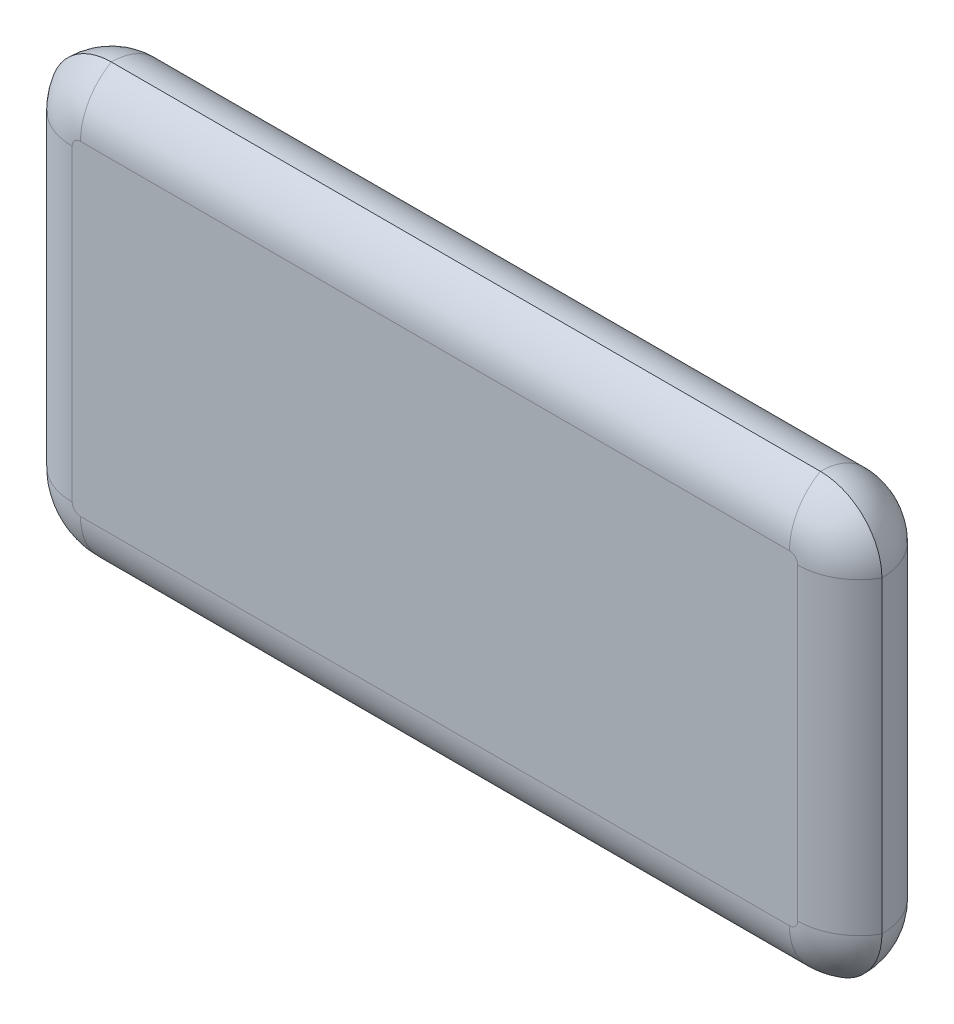
ISO-10303-21;
HEADER;
FILE_DESCRIPTION(('STEP AP214'),'2;1');
FILE_NAME('part.step','',(''),(''),'','','');
FILE_SCHEMA(('AUTOMOTIVE_DESIGN { 1 0 10303 214 1 1 1 1 }'));
ENDSEC;
DATA;
#1=APPLICATION_CONTEXT('core data for automotive mechanical design processes');
#2=APPLICATION_PROTOCOL_DEFINITION('international standard','automotive_design',2000,#1);
#3=PRODUCT_CONTEXT('',#1,'mechanical');
#4=PRODUCT('Part','Part','',(#3));
#5=PRODUCT_RELATED_PRODUCT_CATEGORY('part','',(#4));
#6=PRODUCT_DEFINITION_FORMATION('','',#4);
#7=PRODUCT_DEFINITION_CONTEXT('part definition',#1,'design');
#8=PRODUCT_DEFINITION('design','',#6,#7);
#9=PRODUCT_DEFINITION_SHAPE('','',#8);
#10=(LENGTH_UNIT() NAMED_UNIT(*) SI_UNIT(.MILLI.,.METRE.));
#11=(NAMED_UNIT(*) PLANE_ANGLE_UNIT() SI_UNIT($,.RADIAN.));
#12=(NAMED_UNIT(*) SI_UNIT($,.STERADIAN.) SOLID_ANGLE_UNIT());
#13=UNCERTAINTY_MEASURE_WITH_UNIT(LENGTH_MEASURE(1.E-05),#10,'distance_accuracy_value','');
#14=(GEOMETRIC_REPRESENTATION_CONTEXT(3) GLOBAL_UNCERTAINTY_ASSIGNED_CONTEXT((#13)) GLOBAL_UNIT_ASSIGNED_CONTEXT((#10,
#11,#12)) REPRESENTATION_CONTEXT('',''));
#15=CARTESIAN_POINT('',(0.,0.,0.));
#16=DIRECTION('',(0.,0.,1.));
#17=DIRECTION('',(1.,0.,0.));
#18=AXIS2_PLACEMENT_3D('',#15,#16,#17);
#19=CARTESIAN_POINT('',(0.,0.,15.));
#20=DIRECTION('',(0.,0.,1.));
#21=DIRECTION('',(1.,0.,0.));
#22=AXIS2_PLACEMENT_3D('',#19,#20,#21);
#23=PLANE('',#22);
#24=DIRECTION('',(0.,1.,0.));
#25=VECTOR('',#24,1.);
#26=CARTESIAN_POINT('',(-40.4353382729048,-12.6962963885051,15.));
#27=LINE('',#26,#25);
#28=CARTESIAN_POINT('',(-40.4353382729048,37.3037036114949,15.));
#29=VERTEX_POINT('',#28);
#30=CARTESIAN_POINT('',(-40.4353382729048,-12.6962963885051,15.));
#31=VERTEX_POINT('',#30);
#32=EDGE_CURVE('E57',#29,#31,#27,.F.);
#33=ORIENTED_EDGE('',*,*,#32,.T.);
#34=CARTESIAN_POINT('',(-39.0955923107492,-12.6962963885051,15.));
#35=DIRECTION('',(0.,0.,1.));
#36=DIRECTION('',(1.,0.,0.));
#37=AXIS2_PLACEMENT_3D('',#34,#35,#36);
#38=CIRCLE('',#37,1.33974596215561);
#39=CARTESIAN_POINT('',(-39.0955923107492,-14.0360423506607,15.));
#40=VERTEX_POINT('',#39);
#41=EDGE_CURVE('E11',#31,#40,#38,.T.);
#42=ORIENTED_EDGE('',*,*,#41,.T.);
#43=DIRECTION('',(-1.,0.,0.));
#44=VECTOR('',#43,1.);
#45=CARTESIAN_POINT('',(75.904407689251,-14.0360423506607,15.));
#46=LINE('',#45,#44);
#47=CARTESIAN_POINT('',(75.904407689251,-14.0360423506607,15.));
#48=VERTEX_POINT('',#47);
#49=EDGE_CURVE('E206',#40,#48,#46,.F.);
#50=ORIENTED_EDGE('',*,*,#49,.T.);
#51=CARTESIAN_POINT('',(75.904407689251,-12.6962963885051,15.));
#52=DIRECTION('',(0.,0.,1.));
#53=DIRECTION('',(1.,0.,0.));
#54=AXIS2_PLACEMENT_3D('',#51,#52,#53);
#55=CIRCLE('',#54,1.33974596215561);
#56=CARTESIAN_POINT('',(77.2441536514066,-12.6962963885051,15.));
#57=VERTEX_POINT('',#56);
#58=EDGE_CURVE('E203',#48,#57,#55,.T.);
#59=ORIENTED_EDGE('',*,*,#58,.T.);
#60=DIRECTION('',(0.,-1.,0.));
#61=VECTOR('',#60,1.);
#62=CARTESIAN_POINT('',(77.2441536514066,37.3037036114949,15.));
#63=LINE('',#62,#61);
#64=CARTESIAN_POINT('',(77.2441536514066,37.3037036114949,15.));
#65=VERTEX_POINT('',#64);
#66=EDGE_CURVE('E200',#57,#65,#63,.F.);
#67=ORIENTED_EDGE('',*,*,#66,.T.);
#68=CARTESIAN_POINT('',(75.904407689251,37.3037036114949,15.));
#69=DIRECTION('',(0.,0.,1.));
#70=DIRECTION('',(1.,0.,0.));
#71=AXIS2_PLACEMENT_3D('',#68,#69,#70);
#72=CIRCLE('',#71,1.33974596215561);
#73=CARTESIAN_POINT('',(75.904407689251,38.6434495736505,15.));
#74=VERTEX_POINT('',#73);
#75=EDGE_CURVE('E197',#65,#74,#72,.T.);
#76=ORIENTED_EDGE('',*,*,#75,.T.);
#77=DIRECTION('',(1.,0.,0.));
#78=VECTOR('',#77,1.);
#79=CARTESIAN_POINT('',(-39.0955923107492,38.6434495736505,15.));
#80=LINE('',#79,#78);
#81=CARTESIAN_POINT('',(-39.0955923107492,38.6434495736505,15.));
#82=VERTEX_POINT('',#81);
#83=EDGE_CURVE('E162',#74,#82,#80,.F.);
#84=ORIENTED_EDGE('',*,*,#83,.T.);
#85=CARTESIAN_POINT('',(-39.0955923107492,37.3037036114949,15.));
#86=DIRECTION('',(0.,0.,1.));
#87=DIRECTION('',(1.,0.,0.));
#88=AXIS2_PLACEMENT_3D('',#85,#86,#87);
#89=CIRCLE('',#88,1.33974596215561);
#90=EDGE_CURVE('E68',#82,#29,#89,.T.);
#91=ORIENTED_EDGE('',*,*,#90,.T.);
#92=EDGE_LOOP('',(#33,#42,#50,#59,#67,#76,#84,#91));
#93=FACE_BOUND('',#92,.T.);
#94=ADVANCED_FACE('F47',(#93),#23,.T.);
#95=CARTESIAN_POINT('',(0.,0.,0.));
#96=DIRECTION('',(0.,0.,1.));
#97=DIRECTION('',(1.,0.,0.));
#98=AXIS2_PLACEMENT_3D('',#95,#96,#97);
#99=PLANE('',#98);
#100=DIRECTION('',(0.,-1.,0.));
#101=VECTOR('',#100,1.);
#102=CARTESIAN_POINT('',(-39.0955923107492,0.,0.));
#103=LINE('',#102,#101);
#104=CARTESIAN_POINT('',(-39.0955923107492,-12.6962963885051,0.));
#105=VERTEX_POINT('',#104);
#106=CARTESIAN_POINT('',(-39.0955923107492,37.3037036114949,0.));
#107=VERTEX_POINT('',#106);
#108=EDGE_CURVE('E256',#105,#107,#103,.F.);
#109=ORIENTED_EDGE('',*,*,#108,.T.);
#110=DIRECTION('',(-1.,0.,0.));
#111=VECTOR('',#110,1.);
#112=CARTESIAN_POINT('',(0.,37.3037036114949,0.));
#113=LINE('',#112,#111);
#114=CARTESIAN_POINT('',(75.904407689251,37.3037036114949,0.));
#115=VERTEX_POINT('',#114);
#116=EDGE_CURVE('E252',#107,#115,#113,.F.);
#117=ORIENTED_EDGE('',*,*,#116,.T.);
#118=DIRECTION('',(0.,1.,0.));
#119=VECTOR('',#118,1.);
#120=CARTESIAN_POINT('',(75.904407689251,0.,0.));
#121=LINE('',#120,#119);
#122=CARTESIAN_POINT('',(75.904407689251,-12.6962963885051,0.));
#123=VERTEX_POINT('',#122);
#124=EDGE_CURVE('E148',#115,#123,#121,.F.);
#125=ORIENTED_EDGE('',*,*,#124,.T.);
#126=DIRECTION('',(1.,0.,0.));
#127=VECTOR('',#126,1.);
#128=CARTESIAN_POINT('',(0.,-12.6962963885051,0.));
#129=LINE('',#128,#127);
#130=EDGE_CURVE('E259',#123,#105,#129,.F.);
#131=ORIENTED_EDGE('',*,*,#130,.T.);
#132=EDGE_LOOP('',(#109,#117,#125,#131));
#133=FACE_BOUND('',#132,.T.);
#134=ADVANCED_FACE('F265',(#133),#99,.F.);
#135=CARTESIAN_POINT('',(-39.0955923107492,-12.6962963885051,10.));
#136=DIRECTION('',(0.,0.,1.));
#137=DIRECTION('',(1.,0.,0.));
#138=AXIS2_PLACEMENT_3D('',#135,#136,#137);
#139=SPHERICAL_SURFACE('',#138,10.);
#140=CARTESIAN_POINT('',(-39.0955923107492,-12.6962963885051,10.));
#141=DIRECTION('',(1.,0.,0.));
#142=DIRECTION('',(0.,0.,-1.));
#143=AXIS2_PLACEMENT_3D('',#140,#141,#142);
#144=CIRCLE('',#143,10.);
#145=CARTESIAN_POINT('',(-39.0955923107492,-22.6962963885051,10.));
#146=VERTEX_POINT('',#145);
#147=EDGE_CURVE('E213',#146,#105,#144,.T.);
#148=ORIENTED_EDGE('',*,*,#147,.F.);
#149=CARTESIAN_POINT('',(-39.0955923107492,-12.6962963885051,10.));
#150=DIRECTION('',(0.,0.,-1.));
#151=DIRECTION('',(-1.,0.,0.));
#152=AXIS2_PLACEMENT_3D('',#149,#150,#151);
#153=CIRCLE('',#152,10.);
#154=CARTESIAN_POINT('',(-49.0955923107492,-12.6962963885051,10.));
#155=VERTEX_POINT('',#154);
#156=EDGE_CURVE('E240',#155,#146,#153,.F.);
#157=ORIENTED_EDGE('',*,*,#156,.F.);
#158=CARTESIAN_POINT('',(-39.0955923107492,-12.6962963885051,10.));
#159=DIRECTION('',(0.,1.,0.));
#160=DIRECTION('',(-1.,0.,0.));
#161=AXIS2_PLACEMENT_3D('',#158,#159,#160);
#162=CIRCLE('',#161,10.);
#163=EDGE_CURVE('E159',#105,#155,#162,.T.);
#164=ORIENTED_EDGE('',*,*,#163,.F.);
#165=EDGE_LOOP('',(#148,#157,#164));
#166=FACE_BOUND('',#165,.T.);
#167=ADVANCED_FACE('F291',(#166),#139,.T.);
#168=CARTESIAN_POINT('',(-39.0955923107492,47.3037036114949,10.));
#169=DIRECTION('',(0.,-1.,0.));
#170=DIRECTION('',(1.,0.,0.));
#171=AXIS2_PLACEMENT_3D('',#168,#169,#170);
#172=CYLINDRICAL_SURFACE('',#171,10.);
#173=ORIENTED_EDGE('',*,*,#163,.T.);
#174=DIRECTION('',(0.,-1.,0.));
#175=VECTOR('',#174,1.);
#176=CARTESIAN_POINT('',(-49.0955923107492,47.3037036114949,10.));
#177=LINE('',#176,#175);
#178=CARTESIAN_POINT('',(-49.0955923107492,37.3037036114949,10.));
#179=VERTEX_POINT('',#178);
#180=EDGE_CURVE('E244',#179,#155,#177,.T.);
#181=ORIENTED_EDGE('',*,*,#180,.F.);
#182=CARTESIAN_POINT('',(-39.0955923107492,37.3037036114949,10.));
#183=DIRECTION('',(0.,1.,0.));
#184=DIRECTION('',(0.,0.,1.));
#185=AXIS2_PLACEMENT_3D('',#182,#183,#184);
#186=CIRCLE('',#185,10.);
#187=EDGE_CURVE('E217',#107,#179,#186,.T.);
#188=ORIENTED_EDGE('',*,*,#187,.F.);
#189=ORIENTED_EDGE('',*,*,#108,.F.);
#190=EDGE_LOOP('',(#173,#181,#188,#189));
#191=FACE_BOUND('',#190,.T.);
#192=ADVANCED_FACE('F294',(#191),#172,.T.);
#193=CARTESIAN_POINT('',(-49.0955923107492,-12.6962963885051,10.));
#194=DIRECTION('',(1.,0.,0.));
#195=DIRECTION('',(0.,0.,-1.));
#196=AXIS2_PLACEMENT_3D('',#193,#194,#195);
#197=CYLINDRICAL_SURFACE('',#196,10.);
#198=ORIENTED_EDGE('',*,*,#147,.T.);
#199=ORIENTED_EDGE('',*,*,#130,.F.);
#200=CARTESIAN_POINT('',(75.904407689251,-12.6962963885051,10.));
#201=DIRECTION('',(1.,0.,0.));
#202=DIRECTION('',(0.,0.,-1.));
#203=AXIS2_PLACEMENT_3D('',#200,#201,#202);
#204=CIRCLE('',#203,10.);
#205=CARTESIAN_POINT('',(75.904407689251,-22.6962963885051,10.));
#206=VERTEX_POINT('',#205);
#207=EDGE_CURVE('E221',#206,#123,#204,.T.);
#208=ORIENTED_EDGE('',*,*,#207,.F.);
#209=DIRECTION('',(1.,0.,0.));
#210=VECTOR('',#209,1.);
#211=CARTESIAN_POINT('',(-49.0955923107492,-22.6962963885051,10.));
#212=LINE('',#211,#210);
#213=EDGE_CURVE('E236',#146,#206,#212,.T.);
#214=ORIENTED_EDGE('',*,*,#213,.F.);
#215=EDGE_LOOP('',(#198,#199,#208,#214));
#216=FACE_BOUND('',#215,.T.);
#217=ADVANCED_FACE('F268',(#216),#197,.T.);
#218=CARTESIAN_POINT('',(-39.0955923107492,37.3037036114949,10.));
#219=DIRECTION('',(0.,0.,1.));
#220=DIRECTION('',(1.,0.,0.));
#221=AXIS2_PLACEMENT_3D('',#218,#219,#220);
#222=SPHERICAL_SURFACE('',#221,10.);
#223=ORIENTED_EDGE('',*,*,#187,.T.);
#224=CARTESIAN_POINT('',(-39.0955923107492,37.3037036114949,10.));
#225=DIRECTION('',(0.,0.,-1.));
#226=DIRECTION('',(-1.,0.,0.));
#227=AXIS2_PLACEMENT_3D('',#224,#225,#226);
#228=CIRCLE('',#227,10.);
#229=CARTESIAN_POINT('',(-39.0955923107492,47.3037036114949,10.));
#230=VERTEX_POINT('',#229);
#231=EDGE_CURVE('E248',#230,#179,#228,.F.);
#232=ORIENTED_EDGE('',*,*,#231,.F.);
#233=CARTESIAN_POINT('',(-39.0955923107492,37.3037036114949,10.));
#234=DIRECTION('',(1.,0.,0.));
#235=DIRECTION('',(0.,0.,-1.));
#236=AXIS2_PLACEMENT_3D('',#233,#234,#235);
#237=CIRCLE('',#236,10.);
#238=EDGE_CURVE('E142',#107,#230,#237,.T.);
#239=ORIENTED_EDGE('',*,*,#238,.F.);
#240=EDGE_LOOP('',(#223,#232,#239));
#241=FACE_BOUND('',#240,.T.);
#242=ADVANCED_FACE('F297',(#241),#222,.T.);
#243=CARTESIAN_POINT('',(75.904407689251,-12.6962963885051,10.));
#244=DIRECTION('',(0.,0.,1.));
#245=DIRECTION('',(1.,0.,0.));
#246=AXIS2_PLACEMENT_3D('',#243,#244,#245);
#247=SPHERICAL_SURFACE('',#246,10.);
#248=CARTESIAN_POINT('',(75.904407689251,-12.6962963885051,10.));
#249=DIRECTION('',(0.,0.,-1.));
#250=DIRECTION('',(-1.,0.,0.));
#251=AXIS2_PLACEMENT_3D('',#248,#249,#250);
#252=CIRCLE('',#251,10.);
#253=CARTESIAN_POINT('',(85.904407689251,-12.6962963885051,10.));
#254=VERTEX_POINT('',#253);
#255=EDGE_CURVE('E232',#206,#254,#252,.F.);
#256=ORIENTED_EDGE('',*,*,#255,.F.);
#257=ORIENTED_EDGE('',*,*,#207,.T.);
#258=CARTESIAN_POINT('',(75.904407689251,-12.6962963885051,10.));
#259=DIRECTION('',(0.,1.,0.));
#260=DIRECTION('',(0.,0.,1.));
#261=AXIS2_PLACEMENT_3D('',#258,#259,#260);
#262=CIRCLE('',#261,10.);
#263=EDGE_CURVE('E135',#254,#123,#262,.T.);
#264=ORIENTED_EDGE('',*,*,#263,.F.);
#265=EDGE_LOOP('',(#256,#257,#264));
#266=FACE_BOUND('',#265,.T.);
#267=ADVANCED_FACE('F273',(#266),#247,.T.);
#268=CARTESIAN_POINT('',(-49.0955923107492,37.3037036114949,10.));
#269=DIRECTION('',(-1.,0.,0.));
#270=DIRECTION('',(0.,0.,1.));
#271=AXIS2_PLACEMENT_3D('',#268,#269,#270);
#272=CYLINDRICAL_SURFACE('',#271,10.);
#273=ORIENTED_EDGE('',*,*,#238,.T.);
#274=DIRECTION('',(-1.,0.,0.));
#275=VECTOR('',#274,1.);
#276=CARTESIAN_POINT('',(-49.0955923107492,47.3037036114949,10.));
#277=LINE('',#276,#275);
#278=CARTESIAN_POINT('',(75.904407689251,47.3037036114949,10.));
#279=VERTEX_POINT('',#278);
#280=EDGE_CURVE('E139',#279,#230,#277,.T.);
#281=ORIENTED_EDGE('',*,*,#280,.F.);
#282=CARTESIAN_POINT('',(75.904407689251,37.3037036114949,10.));
#283=DIRECTION('',(1.,0.,0.));
#284=DIRECTION('',(0.,0.,-1.));
#285=AXIS2_PLACEMENT_3D('',#282,#283,#284);
#286=CIRCLE('',#285,10.);
#287=EDGE_CURVE('E124',#115,#279,#286,.T.);
#288=ORIENTED_EDGE('',*,*,#287,.F.);
#289=ORIENTED_EDGE('',*,*,#116,.F.);
#290=EDGE_LOOP('',(#273,#281,#288,#289));
#291=FACE_BOUND('',#290,.T.);
#292=ADVANCED_FACE('F140',(#291),#272,.T.);
#293=CARTESIAN_POINT('',(75.904407689251,47.3037036114949,10.));
#294=DIRECTION('',(0.,1.,0.));
#295=DIRECTION('',(0.,0.,1.));
#296=AXIS2_PLACEMENT_3D('',#293,#294,#295);
#297=CYLINDRICAL_SURFACE('',#296,10.);
#298=ORIENTED_EDGE('',*,*,#263,.T.);
#299=ORIENTED_EDGE('',*,*,#124,.F.);
#300=CARTESIAN_POINT('',(75.904407689251,37.3037036114949,10.));
#301=DIRECTION('',(0.,1.,0.));
#302=DIRECTION('',(0.,0.,1.));
#303=AXIS2_PLACEMENT_3D('',#300,#301,#302);
#304=CIRCLE('',#303,10.);
#305=CARTESIAN_POINT('',(85.904407689251,37.3037036114949,10.));
#306=VERTEX_POINT('',#305);
#307=EDGE_CURVE('E130',#306,#115,#304,.T.);
#308=ORIENTED_EDGE('',*,*,#307,.F.);
#309=DIRECTION('',(0.,1.,0.));
#310=VECTOR('',#309,1.);
#311=CARTESIAN_POINT('',(85.904407689251,47.3037036114949,10.));
#312=LINE('',#311,#310);
#313=EDGE_CURVE('E209',#254,#306,#312,.T.);
#314=ORIENTED_EDGE('',*,*,#313,.F.);
#315=EDGE_LOOP('',(#298,#299,#308,#314));
#316=FACE_BOUND('',#315,.T.);
#317=ADVANCED_FACE('F276',(#316),#297,.T.);
#318=CARTESIAN_POINT('',(75.904407689251,37.3037036114949,10.));
#319=DIRECTION('',(0.,0.,1.));
#320=DIRECTION('',(1.,0.,0.));
#321=AXIS2_PLACEMENT_3D('',#318,#319,#320);
#322=SPHERICAL_SURFACE('',#321,10.);
#323=ORIENTED_EDGE('',*,*,#287,.T.);
#324=CARTESIAN_POINT('',(75.904407689251,37.3037036114949,10.));
#325=DIRECTION('',(0.,0.,-1.));
#326=DIRECTION('',(-1.,0.,0.));
#327=AXIS2_PLACEMENT_3D('',#324,#325,#326);
#328=CIRCLE('',#327,10.);
#329=EDGE_CURVE('E128',#306,#279,#328,.F.);
#330=ORIENTED_EDGE('',*,*,#329,.F.);
#331=ORIENTED_EDGE('',*,*,#307,.T.);
#332=EDGE_LOOP('',(#323,#330,#331));
#333=FACE_BOUND('',#332,.T.);
#334=ADVANCED_FACE('F126',(#333),#322,.T.);
#335=CARTESIAN_POINT('',(75.904407689251,37.3037036114949,5.));
#336=DIRECTION('',(0.,0.,-1.));
#337=DIRECTION('',(-1.,0.,0.));
#338=AXIS2_PLACEMENT_3D('',#335,#336,#337);
#339=DEGENERATE_TOROIDAL_SURFACE('',#338,1.33974596215561,10.,.T.);
#340=CARTESIAN_POINT('',(77.2441536514066,37.3037036114949,5.));
#341=DIRECTION('',(0.,-1.,0.));
#342=DIRECTION('',(0.,0.,-1.));
#343=AXIS2_PLACEMENT_3D('',#340,#341,#342);
#344=CIRCLE('',#343,10.);
#345=EDGE_CURVE('E156',#306,#65,#344,.T.);
#346=ORIENTED_EDGE('',*,*,#345,.F.);
#347=ORIENTED_EDGE('',*,*,#329,.T.);
#348=CARTESIAN_POINT('',(75.904407689251,38.6434495736505,5.));
#349=DIRECTION('',(-1.,0.,0.));
#350=DIRECTION('',(0.,0.,1.));
#351=AXIS2_PLACEMENT_3D('',#348,#349,#350);
#352=CIRCLE('',#351,10.);
#353=EDGE_CURVE('E51',#74,#279,#352,.T.);
#354=ORIENTED_EDGE('',*,*,#353,.F.);
#355=ORIENTED_EDGE('',*,*,#75,.F.);
#356=EDGE_LOOP('',(#346,#347,#354,#355));
#357=FACE_BOUND('',#356,.T.);
#358=ADVANCED_FACE('F49',(#357),#339,.T.);
#359=CARTESIAN_POINT('',(-49.0955923107492,38.6434495736505,5.));
#360=DIRECTION('',(-1.,0.,0.));
#361=DIRECTION('',(0.,0.,1.));
#362=AXIS2_PLACEMENT_3D('',#359,#360,#361);
#363=CYLINDRICAL_SURFACE('',#362,10.);
#364=ORIENTED_EDGE('',*,*,#353,.T.);
#365=ORIENTED_EDGE('',*,*,#280,.T.);
#366=CARTESIAN_POINT('',(-39.0955923107492,38.6434495736505,5.));
#367=DIRECTION('',(-1.,0.,0.));
#368=DIRECTION('',(0.,0.,1.));
#369=AXIS2_PLACEMENT_3D('',#366,#367,#368);
#370=CIRCLE('',#369,10.);
#371=EDGE_CURVE('E167',#82,#230,#370,.T.);
#372=ORIENTED_EDGE('',*,*,#371,.F.);
#373=ORIENTED_EDGE('',*,*,#83,.F.);
#374=EDGE_LOOP('',(#364,#365,#372,#373));
#375=FACE_BOUND('',#374,.T.);
#376=ADVANCED_FACE('F161',(#375),#363,.T.);
#377=CARTESIAN_POINT('',(77.2441536514066,47.3037036114949,5.));
#378=DIRECTION('',(0.,1.,0.));
#379=DIRECTION('',(0.,0.,1.));
#380=AXIS2_PLACEMENT_3D('',#377,#378,#379);
#381=CYLINDRICAL_SURFACE('',#380,10.);
#382=ORIENTED_EDGE('',*,*,#345,.T.);
#383=ORIENTED_EDGE('',*,*,#66,.F.);
#384=CARTESIAN_POINT('',(77.2441536514066,-12.6962963885051,5.));
#385=DIRECTION('',(0.,-1.,0.));
#386=DIRECTION('',(0.,0.,-1.));
#387=AXIS2_PLACEMENT_3D('',#384,#385,#386);
#388=CIRCLE('',#387,10.);
#389=EDGE_CURVE('E171',#254,#57,#388,.T.);
#390=ORIENTED_EDGE('',*,*,#389,.F.);
#391=ORIENTED_EDGE('',*,*,#313,.T.);
#392=EDGE_LOOP('',(#382,#383,#390,#391));
#393=FACE_BOUND('',#392,.T.);
#394=ADVANCED_FACE('F278',(#393),#381,.T.);
#395=CARTESIAN_POINT('',(-39.0955923107492,37.3037036114949,5.));
#396=DIRECTION('',(0.,0.,-1.));
#397=DIRECTION('',(-1.,0.,0.));
#398=AXIS2_PLACEMENT_3D('',#395,#396,#397);
#399=DEGENERATE_TOROIDAL_SURFACE('',#398,1.33974596215561,10.,.T.);
#400=ORIENTED_EDGE('',*,*,#371,.T.);
#401=ORIENTED_EDGE('',*,*,#231,.T.);
#402=CARTESIAN_POINT('',(-40.4353382729048,37.3037036114949,5.));
#403=DIRECTION('',(0.,-1.,0.));
#404=DIRECTION('',(0.,0.,-1.));
#405=AXIS2_PLACEMENT_3D('',#402,#403,#404);
#406=CIRCLE('',#405,10.);
#407=EDGE_CURVE('E177',#29,#179,#406,.T.);
#408=ORIENTED_EDGE('',*,*,#407,.F.);
#409=ORIENTED_EDGE('',*,*,#90,.F.);
#410=EDGE_LOOP('',(#400,#401,#408,#409));
#411=FACE_BOUND('',#410,.T.);
#412=ADVANCED_FACE('F299',(#411),#399,.T.);
#413=CARTESIAN_POINT('',(75.904407689251,-12.6962963885051,5.));
#414=DIRECTION('',(0.,0.,-1.));
#415=DIRECTION('',(-1.,0.,0.));
#416=AXIS2_PLACEMENT_3D('',#413,#414,#415);
#417=DEGENERATE_TOROIDAL_SURFACE('',#416,1.33974596215561,10.,.T.);
#418=ORIENTED_EDGE('',*,*,#389,.T.);
#419=ORIENTED_EDGE('',*,*,#58,.F.);
#420=CARTESIAN_POINT('',(75.904407689251,-14.0360423506607,5.));
#421=DIRECTION('',(-1.,0.,0.));
#422=DIRECTION('',(0.,-1.,0.));
#423=AXIS2_PLACEMENT_3D('',#420,#421,#422);
#424=CIRCLE('',#423,10.);
#425=EDGE_CURVE('E181',#206,#48,#424,.T.);
#426=ORIENTED_EDGE('',*,*,#425,.F.);
#427=ORIENTED_EDGE('',*,*,#255,.T.);
#428=EDGE_LOOP('',(#418,#419,#426,#427));
#429=FACE_BOUND('',#428,.T.);
#430=ADVANCED_FACE('F281',(#429),#417,.T.);
#431=CARTESIAN_POINT('',(-40.4353382729048,47.3037036114949,5.));
#432=DIRECTION('',(0.,-1.,0.));
#433=DIRECTION('',(1.,0.,0.));
#434=AXIS2_PLACEMENT_3D('',#431,#432,#433);
#435=CYLINDRICAL_SURFACE('',#434,10.);
#436=ORIENTED_EDGE('',*,*,#407,.T.);
#437=ORIENTED_EDGE('',*,*,#180,.T.);
#438=CARTESIAN_POINT('',(-40.4353382729048,-12.6962963885051,5.));
#439=DIRECTION('',(0.,-1.,0.));
#440=DIRECTION('',(0.,0.,-1.));
#441=AXIS2_PLACEMENT_3D('',#438,#439,#440);
#442=CIRCLE('',#441,10.);
#443=EDGE_CURVE('E185',#31,#155,#442,.T.);
#444=ORIENTED_EDGE('',*,*,#443,.F.);
#445=ORIENTED_EDGE('',*,*,#32,.F.);
#446=EDGE_LOOP('',(#436,#437,#444,#445));
#447=FACE_BOUND('',#446,.T.);
#448=ADVANCED_FACE('F301',(#447),#435,.T.);
#449=CARTESIAN_POINT('',(-49.0955923107492,-14.0360423506607,5.));
#450=DIRECTION('',(1.,0.,0.));
#451=DIRECTION('',(0.,0.,-1.));
#452=AXIS2_PLACEMENT_3D('',#449,#450,#451);
#453=CYLINDRICAL_SURFACE('',#452,10.);
#454=ORIENTED_EDGE('',*,*,#425,.T.);
#455=ORIENTED_EDGE('',*,*,#49,.F.);
#456=CARTESIAN_POINT('',(-39.0955923107492,-14.0360423506607,5.));
#457=DIRECTION('',(-1.,0.,0.));
#458=DIRECTION('',(0.,0.,1.));
#459=AXIS2_PLACEMENT_3D('',#456,#457,#458);
#460=CIRCLE('',#459,10.);
#461=EDGE_CURVE('E188',#146,#40,#460,.T.);
#462=ORIENTED_EDGE('',*,*,#461,.F.);
#463=ORIENTED_EDGE('',*,*,#213,.T.);
#464=EDGE_LOOP('',(#454,#455,#462,#463));
#465=FACE_BOUND('',#464,.T.);
#466=ADVANCED_FACE('F285',(#465),#453,.T.);
#467=CARTESIAN_POINT('',(-39.0955923107492,-12.6962963885051,5.));
#468=DIRECTION('',(0.,0.,-1.));
#469=DIRECTION('',(-1.,0.,0.));
#470=AXIS2_PLACEMENT_3D('',#467,#468,#469);
#471=DEGENERATE_TOROIDAL_SURFACE('',#470,1.33974596215561,10.,.T.);
#472=ORIENTED_EDGE('',*,*,#443,.T.);
#473=ORIENTED_EDGE('',*,*,#156,.T.);
#474=ORIENTED_EDGE('',*,*,#461,.T.);
#475=ORIENTED_EDGE('',*,*,#41,.F.);
#476=EDGE_LOOP('',(#472,#473,#474,#475));
#477=FACE_BOUND('',#476,.T.);
#478=ADVANCED_FACE('F288',(#477),#471,.T.);
#479=CLOSED_SHELL('',(#94,#134,#167,#192,#217,#242,#267,#292,#317,#334,#358,#376,#394,#412,#430,
#448,#466,#478));
#480=MANIFOLD_SOLID_BREP('B2',#479);
#481=ADVANCED_BREP_SHAPE_REPRESENTATION('',(#18,#480),#14);
#482=SHAPE_DEFINITION_REPRESENTATION(#9,#481);
ENDSEC;
END-ISO-10303-21;
